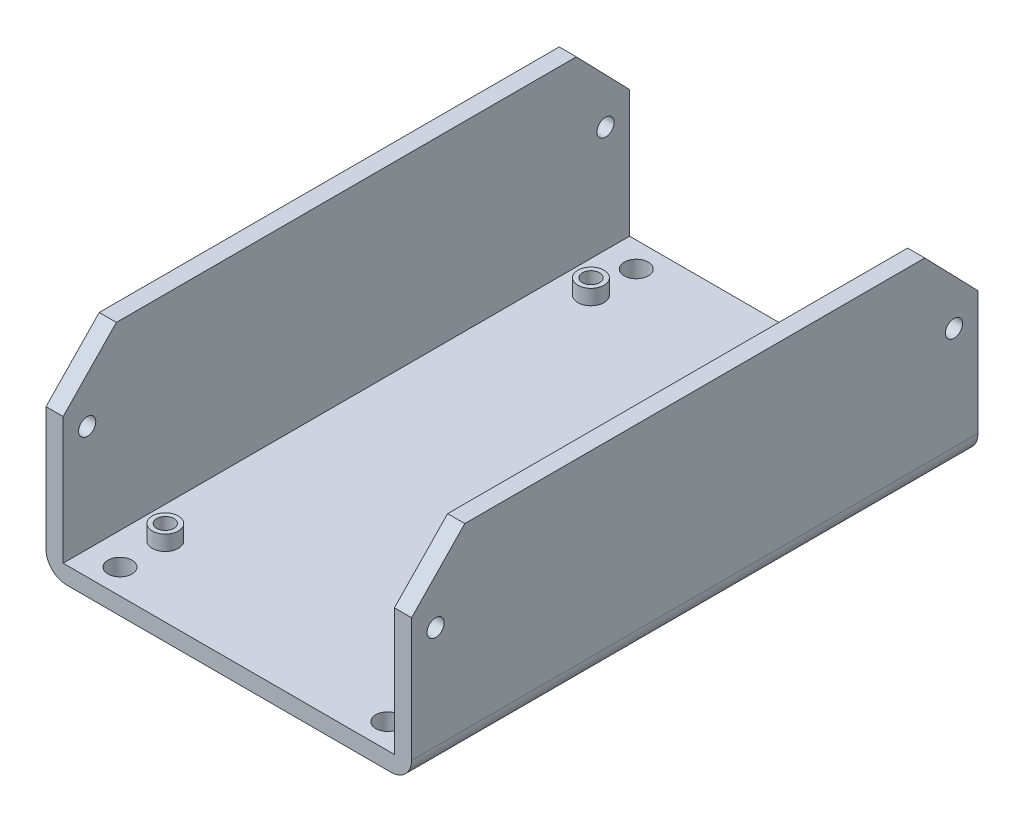
ISO-10303-21;
HEADER;
FILE_DESCRIPTION(('STEP AP214'),'2;1');
FILE_NAME('part.step','',(''),(''),'','','');
FILE_SCHEMA(('AUTOMOTIVE_DESIGN { 1 0 10303 214 1 1 1 1 }'));
ENDSEC;
DATA;
#1=APPLICATION_CONTEXT('core data for automotive mechanical design processes');
#2=APPLICATION_PROTOCOL_DEFINITION('international standard','automotive_design',2000,#1);
#3=PRODUCT_CONTEXT('',#1,'mechanical');
#4=PRODUCT('Part','Part','',(#3));
#5=PRODUCT_RELATED_PRODUCT_CATEGORY('part','',(#4));
#6=PRODUCT_DEFINITION_FORMATION('','',#4);
#7=PRODUCT_DEFINITION_CONTEXT('part definition',#1,'design');
#8=PRODUCT_DEFINITION('design','',#6,#7);
#9=PRODUCT_DEFINITION_SHAPE('','',#8);
#10=(LENGTH_UNIT() NAMED_UNIT(*) SI_UNIT(.MILLI.,.METRE.));
#11=(NAMED_UNIT(*) PLANE_ANGLE_UNIT() SI_UNIT($,.RADIAN.));
#12=(NAMED_UNIT(*) SI_UNIT($,.STERADIAN.) SOLID_ANGLE_UNIT());
#13=UNCERTAINTY_MEASURE_WITH_UNIT(LENGTH_MEASURE(1.E-05),#10,'distance_accuracy_value','');
#14=(GEOMETRIC_REPRESENTATION_CONTEXT(3) GLOBAL_UNCERTAINTY_ASSIGNED_CONTEXT((#13)) GLOBAL_UNIT_ASSIGNED_CONTEXT((#10,
#11,#12)) REPRESENTATION_CONTEXT('',''));
#15=CARTESIAN_POINT('',(0.,0.,0.));
#16=DIRECTION('',(0.,0.,1.));
#17=DIRECTION('',(1.,0.,0.));
#18=AXIS2_PLACEMENT_3D('',#15,#16,#17);
#19=CARTESIAN_POINT('',(-24.125,2.49999999999999,41.25));
#20=DIRECTION('',(-1.,0.,0.));
#21=DIRECTION('',(0.,0.,1.));
#22=AXIS2_PLACEMENT_3D('',#19,#20,#21);
#23=PLANE('',#22);
#24=CARTESIAN_POINT('',(-24.125,18.,-37.75));
#25=DIRECTION('',(-1.,0.,0.));
#26=DIRECTION('',(0.,0.,1.));
#27=AXIS2_PLACEMENT_3D('',#24,#25,#26);
#28=CIRCLE('',#27,1.24999999999999);
#29=CARTESIAN_POINT('',(-24.125,18.,-36.5));
#30=VERTEX_POINT('',#29);
#31=EDGE_CURVE('E360',#30,#30,#28,.F.);
#32=ORIENTED_EDGE('',*,*,#31,.F.);
#33=EDGE_LOOP('',(#32));
#34=FACE_BOUND('',#33,.T.);
#35=DIRECTION('',(0.,1.,0.));
#36=VECTOR('',#35,1.);
#37=CARTESIAN_POINT('',(-24.125,2.49999999999999,-41.25));
#38=LINE('',#37,#36);
#39=CARTESIAN_POINT('',(-24.125,2.49999999999999,-41.25));
#40=VERTEX_POINT('',#39);
#41=CARTESIAN_POINT('',(-24.125,21.,-41.25));
#42=VERTEX_POINT('',#41);
#43=EDGE_CURVE('E255',#40,#42,#38,.T.);
#44=ORIENTED_EDGE('',*,*,#43,.T.);
#45=DIRECTION('',(0.,0.718240222789173,0.695795215827013));
#46=VECTOR('',#45,1.);
#47=CARTESIAN_POINT('',(-24.125,52.6856423173804,-10.5545340050377));
#48=LINE('',#47,#46);
#49=CARTESIAN_POINT('',(-24.125,29.,-33.5));
#50=VERTEX_POINT('',#49);
#51=EDGE_CURVE('E323',#42,#50,#48,.T.);
#52=ORIENTED_EDGE('',*,*,#51,.T.);
#53=DIRECTION('',(0.,0.,-1.));
#54=VECTOR('',#53,1.);
#55=CARTESIAN_POINT('',(-24.125,29.,41.25));
#56=LINE('',#55,#54);
#57=CARTESIAN_POINT('',(-24.125,29.,33.5));
#58=VERTEX_POINT('',#57);
#59=EDGE_CURVE('E265',#58,#50,#56,.T.);
#60=ORIENTED_EDGE('',*,*,#59,.F.);
#61=DIRECTION('',(0.,-0.718240222789173,0.695795215827013));
#62=VECTOR('',#61,1.);
#63=CARTESIAN_POINT('',(-24.125,11.4564231738035,50.4953400503778));
#64=LINE('',#63,#62);
#65=CARTESIAN_POINT('',(-24.125,21.,41.25));
#66=VERTEX_POINT('',#65);
#67=EDGE_CURVE('E320',#58,#66,#64,.T.);
#68=ORIENTED_EDGE('',*,*,#67,.T.);
#69=DIRECTION('',(0.,1.,0.));
#70=VECTOR('',#69,1.);
#71=CARTESIAN_POINT('',(-24.125,2.49999999999999,41.25));
#72=LINE('',#71,#70);
#73=CARTESIAN_POINT('',(-24.125,2.49999999999999,41.25));
#74=VERTEX_POINT('',#73);
#75=EDGE_CURVE('E264',#74,#66,#72,.T.);
#76=ORIENTED_EDGE('',*,*,#75,.F.);
#77=DIRECTION('',(0.,0.,-1.));
#78=VECTOR('',#77,1.);
#79=CARTESIAN_POINT('',(-24.125,2.49999999999999,41.25));
#80=LINE('',#79,#78);
#81=EDGE_CURVE('E249',#74,#40,#80,.T.);
#82=ORIENTED_EDGE('',*,*,#81,.T.);
#83=EDGE_LOOP('',(#44,#52,#60,#68,#76,#82));
#84=FACE_BOUND('',#83,.T.);
#85=CARTESIAN_POINT('',(-24.125,18.,37.75));
#86=DIRECTION('',(-1.,0.,0.));
#87=DIRECTION('',(0.,0.,1.));
#88=AXIS2_PLACEMENT_3D('',#85,#86,#87);
#89=CIRCLE('',#88,1.24999999999999);
#90=CARTESIAN_POINT('',(-24.125,18.,39.));
#91=VERTEX_POINT('',#90);
#92=EDGE_CURVE('E354',#91,#91,#89,.F.);
#93=ORIENTED_EDGE('',*,*,#92,.F.);
#94=EDGE_LOOP('',(#93));
#95=FACE_BOUND('',#94,.T.);
#96=ADVANCED_FACE('F49',(#34,#84,#95),#23,.F.);
#97=CARTESIAN_POINT('',(24.125,29.,41.25));
#98=DIRECTION('',(1.,0.,0.));
#99=DIRECTION('',(0.,0.,-1.));
#100=AXIS2_PLACEMENT_3D('',#97,#98,#99);
#101=PLANE('',#100);
#102=DIRECTION('',(0.,0.,-1.));
#103=VECTOR('',#102,1.);
#104=CARTESIAN_POINT('',(24.125,29.,41.25));
#105=LINE('',#104,#103);
#106=CARTESIAN_POINT('',(24.125,29.,33.5));
#107=VERTEX_POINT('',#106);
#108=CARTESIAN_POINT('',(24.125,29.,-33.5));
#109=VERTEX_POINT('',#108);
#110=EDGE_CURVE('E178',#107,#109,#105,.T.);
#111=ORIENTED_EDGE('',*,*,#110,.T.);
#112=DIRECTION('',(0.,-0.718240222789173,-0.695795215827013));
#113=VECTOR('',#112,1.);
#114=CARTESIAN_POINT('',(24.125,66.3561712846348,2.68879093198998));
#115=LINE('',#114,#113);
#116=CARTESIAN_POINT('',(24.125,21.,-41.25));
#117=VERTEX_POINT('',#116);
#118=EDGE_CURVE('E155',#109,#117,#115,.T.);
#119=ORIENTED_EDGE('',*,*,#118,.T.);
#120=DIRECTION('',(0.,-1.,0.));
#121=VECTOR('',#120,1.);
#122=CARTESIAN_POINT('',(24.125,29.,-41.25));
#123=LINE('',#122,#121);
#124=CARTESIAN_POINT('',(24.125,2.49999999999999,-41.25));
#125=VERTEX_POINT('',#124);
#126=EDGE_CURVE('E256',#117,#125,#123,.T.);
#127=ORIENTED_EDGE('',*,*,#126,.T.);
#128=DIRECTION('',(0.,0.,-1.));
#129=VECTOR('',#128,1.);
#130=CARTESIAN_POINT('',(24.125,2.49999999999999,41.25));
#131=LINE('',#130,#129);
#132=CARTESIAN_POINT('',(24.125,2.49999999999999,41.25));
#133=VERTEX_POINT('',#132);
#134=EDGE_CURVE('E182',#133,#125,#131,.T.);
#135=ORIENTED_EDGE('',*,*,#134,.F.);
#136=DIRECTION('',(0.,-1.,0.));
#137=VECTOR('',#136,1.);
#138=CARTESIAN_POINT('',(24.125,29.,41.25));
#139=LINE('',#138,#137);
#140=CARTESIAN_POINT('',(24.125,21.,41.25));
#141=VERTEX_POINT('',#140);
#142=EDGE_CURVE('E285',#141,#133,#139,.T.);
#143=ORIENTED_EDGE('',*,*,#142,.F.);
#144=DIRECTION('',(0.,0.718240222789173,-0.695795215827013));
#145=VECTOR('',#144,1.);
#146=CARTESIAN_POINT('',(24.125,25.1269521410579,37.2520151133501));
#147=LINE('',#146,#145);
#148=EDGE_CURVE('E64',#141,#107,#147,.T.);
#149=ORIENTED_EDGE('',*,*,#148,.T.);
#150=EDGE_LOOP('',(#111,#119,#127,#135,#143,#149));
#151=FACE_BOUND('',#150,.T.);
#152=CARTESIAN_POINT('',(24.125,18.,37.75));
#153=DIRECTION('',(1.,0.,0.));
#154=DIRECTION('',(0.,0.,-1.));
#155=AXIS2_PLACEMENT_3D('',#152,#153,#154);
#156=CIRCLE('',#155,1.24999999999999);
#157=CARTESIAN_POINT('',(24.125,18.,36.5));
#158=VERTEX_POINT('',#157);
#159=EDGE_CURVE('E340',#158,#158,#156,.F.);
#160=ORIENTED_EDGE('',*,*,#159,.F.);
#161=EDGE_LOOP('',(#160));
#162=FACE_BOUND('',#161,.T.);
#163=CARTESIAN_POINT('',(24.125,18.,-37.75));
#164=DIRECTION('',(1.,0.,0.));
#165=DIRECTION('',(0.,0.,-1.));
#166=AXIS2_PLACEMENT_3D('',#163,#164,#165);
#167=CIRCLE('',#166,1.24999999999999);
#168=CARTESIAN_POINT('',(24.125,18.,-39.));
#169=VERTEX_POINT('',#168);
#170=EDGE_CURVE('E348',#169,#169,#167,.F.);
#171=ORIENTED_EDGE('',*,*,#170,.F.);
#172=EDGE_LOOP('',(#171));
#173=FACE_BOUND('',#172,.T.);
#174=ADVANCED_FACE('F298',(#151,#162,#173),#101,.F.);
#175=CARTESIAN_POINT('',(-24.125,29.,41.25));
#176=DIRECTION('',(0.,-1.,0.));
#177=DIRECTION('',(1.,0.,0.));
#178=AXIS2_PLACEMENT_3D('',#175,#176,#177);
#179=PLANE('',#178);
#180=ORIENTED_EDGE('',*,*,#59,.T.);
#181=DIRECTION('',(1.,0.,0.));
#182=VECTOR('',#181,1.);
#183=CARTESIAN_POINT('',(-26.625,29.,-33.5));
#184=LINE('',#183,#182);
#185=CARTESIAN_POINT('',(-26.625,29.,-33.5));
#186=VERTEX_POINT('',#185);
#187=EDGE_CURVE('E160',#186,#50,#184,.T.);
#188=ORIENTED_EDGE('',*,*,#187,.F.);
#189=DIRECTION('',(0.,0.,-1.));
#190=VECTOR('',#189,1.);
#191=CARTESIAN_POINT('',(-26.625,29.,41.25));
#192=LINE('',#191,#190);
#193=CARTESIAN_POINT('',(-26.625,29.,33.5));
#194=VERTEX_POINT('',#193);
#195=EDGE_CURVE('E194',#194,#186,#192,.T.);
#196=ORIENTED_EDGE('',*,*,#195,.F.);
#197=DIRECTION('',(1.,0.,0.));
#198=VECTOR('',#197,1.);
#199=CARTESIAN_POINT('',(-26.625,29.,33.5));
#200=LINE('',#199,#198);
#201=EDGE_CURVE('E172',#194,#58,#200,.T.);
#202=ORIENTED_EDGE('',*,*,#201,.T.);
#203=EDGE_LOOP('',(#180,#188,#196,#202));
#204=FACE_BOUND('',#203,.T.);
#205=ADVANCED_FACE('F51',(#204),#179,.F.);
#206=CARTESIAN_POINT('',(-26.625,29.,41.25));
#207=DIRECTION('',(1.,0.,0.));
#208=DIRECTION('',(0.,1.,0.));
#209=AXIS2_PLACEMENT_3D('',#206,#207,#208);
#210=PLANE('',#209);
#211=CARTESIAN_POINT('',(-26.625,18.,-37.75));
#212=DIRECTION('',(-1.,0.,0.));
#213=DIRECTION('',(0.,0.,1.));
#214=AXIS2_PLACEMENT_3D('',#211,#212,#213);
#215=CIRCLE('',#214,1.24999999999999);
#216=CARTESIAN_POINT('',(-26.625,18.,-36.5));
#217=VERTEX_POINT('',#216);
#218=EDGE_CURVE('E363',#217,#217,#215,.T.);
#219=ORIENTED_EDGE('',*,*,#218,.F.);
#220=EDGE_LOOP('',(#219));
#221=FACE_BOUND('',#220,.T.);
#222=CARTESIAN_POINT('',(-26.625,18.,37.75));
#223=DIRECTION('',(-1.,0.,0.));
#224=DIRECTION('',(0.,0.,1.));
#225=AXIS2_PLACEMENT_3D('',#222,#223,#224);
#226=CIRCLE('',#225,1.24999999999999);
#227=CARTESIAN_POINT('',(-26.625,18.,39.));
#228=VERTEX_POINT('',#227);
#229=EDGE_CURVE('E357',#228,#228,#226,.T.);
#230=ORIENTED_EDGE('',*,*,#229,.F.);
#231=EDGE_LOOP('',(#230));
#232=FACE_BOUND('',#231,.T.);
#233=ORIENTED_EDGE('',*,*,#195,.T.);
#234=DIRECTION('',(0.,-0.718240222789173,-0.695795215827013));
#235=VECTOR('',#234,1.);
#236=CARTESIAN_POINT('',(-26.625,29.,-33.5));
#237=LINE('',#236,#235);
#238=CARTESIAN_POINT('',(-26.625,21.,-41.25));
#239=VERTEX_POINT('',#238);
#240=EDGE_CURVE('E161',#186,#239,#237,.T.);
#241=ORIENTED_EDGE('',*,*,#240,.T.);
#242=DIRECTION('',(0.,-1.,0.));
#243=VECTOR('',#242,1.);
#244=CARTESIAN_POINT('',(-26.625,29.,-41.25));
#245=LINE('',#244,#243);
#246=CARTESIAN_POINT('',(-26.625,3.,-41.25));
#247=VERTEX_POINT('',#246);
#248=EDGE_CURVE('E289',#239,#247,#245,.T.);
#249=ORIENTED_EDGE('',*,*,#248,.T.);
#250=DIRECTION('',(0.,0.,-1.));
#251=VECTOR('',#250,1.);
#252=CARTESIAN_POINT('',(-26.625,3.,41.25));
#253=LINE('',#252,#251);
#254=CARTESIAN_POINT('',(-26.625,3.,41.25));
#255=VERTEX_POINT('',#254);
#256=EDGE_CURVE('E191',#255,#247,#253,.T.);
#257=ORIENTED_EDGE('',*,*,#256,.F.);
#258=DIRECTION('',(0.,-1.,0.));
#259=VECTOR('',#258,1.);
#260=CARTESIAN_POINT('',(-26.625,29.,41.25));
#261=LINE('',#260,#259);
#262=CARTESIAN_POINT('',(-26.625,21.,41.25));
#263=VERTEX_POINT('',#262);
#264=EDGE_CURVE('E271',#263,#255,#261,.T.);
#265=ORIENTED_EDGE('',*,*,#264,.F.);
#266=DIRECTION('',(0.,0.718240222789173,-0.695795215827013));
#267=VECTOR('',#266,1.);
#268=CARTESIAN_POINT('',(-26.625,21.,41.25));
#269=LINE('',#268,#267);
#270=EDGE_CURVE('E72',#263,#194,#269,.T.);
#271=ORIENTED_EDGE('',*,*,#270,.T.);
#272=EDGE_LOOP('',(#233,#241,#249,#257,#265,#271));
#273=FACE_BOUND('',#272,.T.);
#274=ADVANCED_FACE('F449',(#221,#232,#273),#210,.F.);
#275=CARTESIAN_POINT('',(-23.625,3.,41.25));
#276=DIRECTION('',(0.,0.,-1.));
#277=DIRECTION('',(-1.,0.,0.));
#278=AXIS2_PLACEMENT_3D('',#275,#276,#277);
#279=CYLINDRICAL_SURFACE('',#278,3.);
#280=CARTESIAN_POINT('',(-23.625,3.,-41.25));
#281=DIRECTION('',(0.,0.,1.));
#282=DIRECTION('',(1.,0.,0.));
#283=AXIS2_PLACEMENT_3D('',#280,#281,#282);
#284=CIRCLE('',#283,3.);
#285=CARTESIAN_POINT('',(-23.625,0.,-41.25));
#286=VERTEX_POINT('',#285);
#287=EDGE_CURVE('E291',#247,#286,#284,.T.);
#288=ORIENTED_EDGE('',*,*,#287,.T.);
#289=DIRECTION('',(0.,0.,-1.));
#290=VECTOR('',#289,1.);
#291=CARTESIAN_POINT('',(-23.625,0.,41.25));
#292=LINE('',#291,#290);
#293=CARTESIAN_POINT('',(-23.625,0.,41.25));
#294=VERTEX_POINT('',#293);
#295=EDGE_CURVE('E188',#294,#286,#292,.T.);
#296=ORIENTED_EDGE('',*,*,#295,.F.);
#297=CARTESIAN_POINT('',(-23.625,3.,41.25));
#298=DIRECTION('',(0.,0.,1.));
#299=DIRECTION('',(1.,0.,0.));
#300=AXIS2_PLACEMENT_3D('',#297,#298,#299);
#301=CIRCLE('',#300,3.);
#302=EDGE_CURVE('E273',#255,#294,#301,.T.);
#303=ORIENTED_EDGE('',*,*,#302,.F.);
#304=ORIENTED_EDGE('',*,*,#256,.T.);
#305=EDGE_LOOP('',(#288,#296,#303,#304));
#306=FACE_BOUND('',#305,.T.);
#307=ADVANCED_FACE('F446',(#306),#279,.T.);
#308=CARTESIAN_POINT('',(-23.625,0.,41.25));
#309=DIRECTION('',(0.,1.,0.));
#310=DIRECTION('',(-1.,0.,0.));
#311=AXIS2_PLACEMENT_3D('',#308,#309,#310);
#312=PLANE('',#311);
#313=CARTESIAN_POINT('',(19.5,0.,-31.));
#314=DIRECTION('',(0.,1.,0.));
#315=DIRECTION('',(0.,0.,1.));
#316=AXIS2_PLACEMENT_3D('',#313,#314,#315);
#317=CIRCLE('',#316,1.24999999999999);
#318=CARTESIAN_POINT('',(19.5,0.,-29.75));
#319=VERTEX_POINT('',#318);
#320=EDGE_CURVE('E398',#319,#319,#317,.T.);
#321=ORIENTED_EDGE('',*,*,#320,.T.);
#322=EDGE_LOOP('',(#321));
#323=FACE_BOUND('',#322,.T.);
#324=CARTESIAN_POINT('',(-19.5,0.,-31.));
#325=DIRECTION('',(0.,1.,0.));
#326=DIRECTION('',(0.,0.,1.));
#327=AXIS2_PLACEMENT_3D('',#324,#325,#326);
#328=CIRCLE('',#327,1.24999999999999);
#329=CARTESIAN_POINT('',(-19.5,0.,-29.75));
#330=VERTEX_POINT('',#329);
#331=EDGE_CURVE('E392',#330,#330,#328,.T.);
#332=ORIENTED_EDGE('',*,*,#331,.T.);
#333=EDGE_LOOP('',(#332));
#334=FACE_BOUND('',#333,.T.);
#335=CARTESIAN_POINT('',(19.5,0.,31.));
#336=DIRECTION('',(0.,1.,0.));
#337=DIRECTION('',(0.,0.,1.));
#338=AXIS2_PLACEMENT_3D('',#335,#336,#337);
#339=CIRCLE('',#338,1.24999999999999);
#340=CARTESIAN_POINT('',(19.5,0.,32.25));
#341=VERTEX_POINT('',#340);
#342=EDGE_CURVE('E386',#341,#341,#339,.T.);
#343=ORIENTED_EDGE('',*,*,#342,.T.);
#344=EDGE_LOOP('',(#343));
#345=FACE_BOUND('',#344,.T.);
#346=CARTESIAN_POINT('',(-19.5,0.,31.));
#347=DIRECTION('',(0.,1.,0.));
#348=DIRECTION('',(0.,0.,1.));
#349=AXIS2_PLACEMENT_3D('',#346,#347,#348);
#350=CIRCLE('',#349,1.24999999999999);
#351=CARTESIAN_POINT('',(-19.5,0.,32.25));
#352=VERTEX_POINT('',#351);
#353=EDGE_CURVE('E380',#352,#352,#350,.T.);
#354=ORIENTED_EDGE('',*,*,#353,.T.);
#355=EDGE_LOOP('',(#354));
#356=FACE_BOUND('',#355,.T.);
#357=CARTESIAN_POINT('',(19.5,0.,-37.6));
#358=DIRECTION('',(0.,-1.,0.));
#359=DIRECTION('',(1.,0.,0.));
#360=AXIS2_PLACEMENT_3D('',#357,#358,#359);
#361=CIRCLE('',#360,1.75);
#362=CARTESIAN_POINT('',(21.25,0.,-37.6));
#363=VERTEX_POINT('',#362);
#364=EDGE_CURVE('E336',#363,#363,#361,.T.);
#365=ORIENTED_EDGE('',*,*,#364,.F.);
#366=EDGE_LOOP('',(#365));
#367=FACE_BOUND('',#366,.T.);
#368=CARTESIAN_POINT('',(19.5,0.,37.6));
#369=DIRECTION('',(0.,-1.,0.));
#370=DIRECTION('',(1.,0.,0.));
#371=AXIS2_PLACEMENT_3D('',#368,#369,#370);
#372=CIRCLE('',#371,1.75);
#373=CARTESIAN_POINT('',(21.25,0.,37.6));
#374=VERTEX_POINT('',#373);
#375=EDGE_CURVE('E339',#374,#374,#372,.T.);
#376=ORIENTED_EDGE('',*,*,#375,.F.);
#377=EDGE_LOOP('',(#376));
#378=FACE_BOUND('',#377,.T.);
#379=CARTESIAN_POINT('',(-19.5,0.,37.6));
#380=DIRECTION('',(0.,-1.,0.));
#381=DIRECTION('',(1.,0.,0.));
#382=AXIS2_PLACEMENT_3D('',#379,#380,#381);
#383=CIRCLE('',#382,1.75);
#384=CARTESIAN_POINT('',(-17.75,0.,37.6));
#385=VERTEX_POINT('',#384);
#386=EDGE_CURVE('E335',#385,#385,#383,.T.);
#387=ORIENTED_EDGE('',*,*,#386,.F.);
#388=EDGE_LOOP('',(#387));
#389=FACE_BOUND('',#388,.T.);
#390=CARTESIAN_POINT('',(-19.5,0.,-37.6));
#391=DIRECTION('',(0.,-1.,0.));
#392=DIRECTION('',(1.,0.,0.));
#393=AXIS2_PLACEMENT_3D('',#390,#391,#392);
#394=CIRCLE('',#393,1.75);
#395=CARTESIAN_POINT('',(-17.75,0.,-37.6));
#396=VERTEX_POINT('',#395);
#397=EDGE_CURVE('E206',#396,#396,#394,.T.);
#398=ORIENTED_EDGE('',*,*,#397,.F.);
#399=EDGE_LOOP('',(#398));
#400=FACE_BOUND('',#399,.T.);
#401=DIRECTION('',(1.,0.,0.));
#402=VECTOR('',#401,1.);
#403=CARTESIAN_POINT('',(-23.625,0.,-41.25));
#404=LINE('',#403,#402);
#405=CARTESIAN_POINT('',(23.625,0.,-41.25));
#406=VERTEX_POINT('',#405);
#407=EDGE_CURVE('E293',#286,#406,#404,.T.);
#408=ORIENTED_EDGE('',*,*,#407,.T.);
#409=DIRECTION('',(0.,0.,-1.));
#410=VECTOR('',#409,1.);
#411=CARTESIAN_POINT('',(23.625,0.,41.25));
#412=LINE('',#411,#410);
#413=CARTESIAN_POINT('',(23.625,0.,41.25));
#414=VERTEX_POINT('',#413);
#415=EDGE_CURVE('E180',#414,#406,#412,.T.);
#416=ORIENTED_EDGE('',*,*,#415,.F.);
#417=DIRECTION('',(1.,0.,0.));
#418=VECTOR('',#417,1.);
#419=CARTESIAN_POINT('',(-23.625,0.,41.25));
#420=LINE('',#419,#418);
#421=EDGE_CURVE('E314',#294,#414,#420,.T.);
#422=ORIENTED_EDGE('',*,*,#421,.F.);
#423=ORIENTED_EDGE('',*,*,#295,.T.);
#424=EDGE_LOOP('',(#408,#416,#422,#423));
#425=FACE_BOUND('',#424,.T.);
#426=ADVANCED_FACE('F443',(#323,#334,#345,#356,#367,#378,#389,#400,#425),#312,.F.);
#427=CARTESIAN_POINT('',(23.625,3.,41.25));
#428=DIRECTION('',(0.,0.,-1.));
#429=DIRECTION('',(-1.,0.,0.));
#430=AXIS2_PLACEMENT_3D('',#427,#428,#429);
#431=CYLINDRICAL_SURFACE('',#430,3.);
#432=CARTESIAN_POINT('',(23.625,3.,-41.25));
#433=DIRECTION('',(0.,0.,1.));
#434=DIRECTION('',(1.,0.,0.));
#435=AXIS2_PLACEMENT_3D('',#432,#433,#434);
#436=CIRCLE('',#435,3.);
#437=CARTESIAN_POINT('',(26.625,3.,-41.25));
#438=VERTEX_POINT('',#437);
#439=EDGE_CURVE('E295',#406,#438,#436,.T.);
#440=ORIENTED_EDGE('',*,*,#439,.T.);
#441=DIRECTION('',(0.,0.,-1.));
#442=VECTOR('',#441,1.);
#443=CARTESIAN_POINT('',(26.625,3.,41.25));
#444=LINE('',#443,#442);
#445=CARTESIAN_POINT('',(26.625,3.,41.25));
#446=VERTEX_POINT('',#445);
#447=EDGE_CURVE('E177',#446,#438,#444,.T.);
#448=ORIENTED_EDGE('',*,*,#447,.F.);
#449=CARTESIAN_POINT('',(23.625,3.,41.25));
#450=DIRECTION('',(0.,0.,1.));
#451=DIRECTION('',(1.,0.,0.));
#452=AXIS2_PLACEMENT_3D('',#449,#450,#451);
#453=CIRCLE('',#452,3.);
#454=EDGE_CURVE('E312',#414,#446,#453,.T.);
#455=ORIENTED_EDGE('',*,*,#454,.F.);
#456=ORIENTED_EDGE('',*,*,#415,.T.);
#457=EDGE_LOOP('',(#440,#448,#455,#456));
#458=FACE_BOUND('',#457,.T.);
#459=ADVANCED_FACE('F306',(#458),#431,.T.);
#460=CARTESIAN_POINT('',(26.625,3.,41.25));
#461=DIRECTION('',(-1.,0.,0.));
#462=DIRECTION('',(0.,-1.,0.));
#463=AXIS2_PLACEMENT_3D('',#460,#461,#462);
#464=PLANE('',#463);
#465=CARTESIAN_POINT('',(26.625,18.,-37.75));
#466=DIRECTION('',(1.,0.,0.));
#467=DIRECTION('',(0.,0.,-1.));
#468=AXIS2_PLACEMENT_3D('',#465,#466,#467);
#469=CIRCLE('',#468,1.24999999999999);
#470=CARTESIAN_POINT('',(26.625,18.,-39.));
#471=VERTEX_POINT('',#470);
#472=EDGE_CURVE('E351',#471,#471,#469,.T.);
#473=ORIENTED_EDGE('',*,*,#472,.F.);
#474=EDGE_LOOP('',(#473));
#475=FACE_BOUND('',#474,.T.);
#476=CARTESIAN_POINT('',(26.625,18.,37.75));
#477=DIRECTION('',(1.,0.,0.));
#478=DIRECTION('',(0.,0.,-1.));
#479=AXIS2_PLACEMENT_3D('',#476,#477,#478);
#480=CIRCLE('',#479,1.24999999999999);
#481=CARTESIAN_POINT('',(26.625,18.,36.5));
#482=VERTEX_POINT('',#481);
#483=EDGE_CURVE('E345',#482,#482,#480,.T.);
#484=ORIENTED_EDGE('',*,*,#483,.F.);
#485=EDGE_LOOP('',(#484));
#486=FACE_BOUND('',#485,.T.);
#487=DIRECTION('',(0.,1.,0.));
#488=VECTOR('',#487,1.);
#489=CARTESIAN_POINT('',(26.625,3.,-41.25));
#490=LINE('',#489,#488);
#491=CARTESIAN_POINT('',(26.625,21.,-41.25));
#492=VERTEX_POINT('',#491);
#493=EDGE_CURVE('E171',#438,#492,#490,.T.);
#494=ORIENTED_EDGE('',*,*,#493,.T.);
#495=DIRECTION('',(0.,-0.718240222789173,-0.695795215827013));
#496=VECTOR('',#495,1.);
#497=CARTESIAN_POINT('',(26.625,29.,-33.5));
#498=LINE('',#497,#496);
#499=CARTESIAN_POINT('',(26.625,29.,-33.5));
#500=VERTEX_POINT('',#499);
#501=EDGE_CURVE('E152',#500,#492,#498,.T.);
#502=ORIENTED_EDGE('',*,*,#501,.F.);
#503=DIRECTION('',(0.,0.,-1.));
#504=VECTOR('',#503,1.);
#505=CARTESIAN_POINT('',(26.625,29.,41.25));
#506=LINE('',#505,#504);
#507=CARTESIAN_POINT('',(26.625,29.,33.5));
#508=VERTEX_POINT('',#507);
#509=EDGE_CURVE('E168',#508,#500,#506,.T.);
#510=ORIENTED_EDGE('',*,*,#509,.F.);
#511=DIRECTION('',(0.,0.718240222789173,-0.695795215827013));
#512=VECTOR('',#511,1.);
#513=CARTESIAN_POINT('',(26.625,21.,41.25));
#514=LINE('',#513,#512);
#515=CARTESIAN_POINT('',(26.625,21.,41.25));
#516=VERTEX_POINT('',#515);
#517=EDGE_CURVE('E215',#516,#508,#514,.T.);
#518=ORIENTED_EDGE('',*,*,#517,.F.);
#519=DIRECTION('',(0.,1.,0.));
#520=VECTOR('',#519,1.);
#521=CARTESIAN_POINT('',(26.625,3.,41.25));
#522=LINE('',#521,#520);
#523=EDGE_CURVE('E311',#446,#516,#522,.T.);
#524=ORIENTED_EDGE('',*,*,#523,.F.);
#525=ORIENTED_EDGE('',*,*,#447,.T.);
#526=EDGE_LOOP('',(#494,#502,#510,#518,#524,#525));
#527=FACE_BOUND('',#526,.T.);
#528=ADVANCED_FACE('F166',(#475,#486,#527),#464,.F.);
#529=CARTESIAN_POINT('',(26.625,29.,41.25));
#530=DIRECTION('',(0.,-1.,0.));
#531=DIRECTION('',(1.,0.,0.));
#532=AXIS2_PLACEMENT_3D('',#529,#530,#531);
#533=PLANE('',#532);
#534=ORIENTED_EDGE('',*,*,#509,.T.);
#535=EDGE_CURVE('E149',#109,#500,#184,.T.);
#536=ORIENTED_EDGE('',*,*,#535,.F.);
#537=ORIENTED_EDGE('',*,*,#110,.F.);
#538=EDGE_CURVE('E176',#107,#508,#200,.T.);
#539=ORIENTED_EDGE('',*,*,#538,.T.);
#540=EDGE_LOOP('',(#534,#536,#537,#539));
#541=FACE_BOUND('',#540,.T.);
#542=ADVANCED_FACE('F175',(#541),#533,.F.);
#543=CARTESIAN_POINT('',(24.125,2.49999999999999,41.25));
#544=DIRECTION('',(0.,-1.,0.));
#545=DIRECTION('',(0.,0.,-1.));
#546=AXIS2_PLACEMENT_3D('',#543,#544,#545);
#547=PLANE('',#546);
#548=CARTESIAN_POINT('',(-19.5,2.49999999999999,-31.));
#549=DIRECTION('',(0.,-1.,0.));
#550=DIRECTION('',(0.,0.,-1.));
#551=AXIS2_PLACEMENT_3D('',#548,#549,#550);
#552=CIRCLE('',#551,1.9);
#553=CARTESIAN_POINT('',(-19.5,2.49999999999999,-32.9));
#554=VERTEX_POINT('',#553);
#555=EDGE_CURVE('E13',#554,#554,#552,.F.);
#556=ORIENTED_EDGE('',*,*,#555,.F.);
#557=EDGE_LOOP('',(#556));
#558=FACE_BOUND('',#557,.T.);
#559=CARTESIAN_POINT('',(-19.5,2.49999999999999,31.));
#560=DIRECTION('',(0.,-1.,0.));
#561=DIRECTION('',(0.,0.,-1.));
#562=AXIS2_PLACEMENT_3D('',#559,#560,#561);
#563=CIRCLE('',#562,1.9);
#564=CARTESIAN_POINT('',(-19.5,2.49999999999999,29.1));
#565=VERTEX_POINT('',#564);
#566=EDGE_CURVE('E57',#565,#565,#563,.F.);
#567=ORIENTED_EDGE('',*,*,#566,.F.);
#568=EDGE_LOOP('',(#567));
#569=FACE_BOUND('',#568,.T.);
#570=CARTESIAN_POINT('',(19.5,2.49999999999999,31.));
#571=DIRECTION('',(0.,-1.,0.));
#572=DIRECTION('',(0.,0.,-1.));
#573=AXIS2_PLACEMENT_3D('',#570,#571,#572);
#574=CIRCLE('',#573,1.9);
#575=CARTESIAN_POINT('',(19.5,2.49999999999999,29.1));
#576=VERTEX_POINT('',#575);
#577=EDGE_CURVE('E218',#576,#576,#574,.F.);
#578=ORIENTED_EDGE('',*,*,#577,.F.);
#579=EDGE_LOOP('',(#578));
#580=FACE_BOUND('',#579,.T.);
#581=CARTESIAN_POINT('',(19.5,2.49999999999999,-31.));
#582=DIRECTION('',(0.,-1.,0.));
#583=DIRECTION('',(0.,0.,-1.));
#584=AXIS2_PLACEMENT_3D('',#581,#582,#583);
#585=CIRCLE('',#584,1.9);
#586=CARTESIAN_POINT('',(19.5,2.49999999999999,-32.9));
#587=VERTEX_POINT('',#586);
#588=EDGE_CURVE('E201',#587,#587,#585,.F.);
#589=ORIENTED_EDGE('',*,*,#588,.F.);
#590=EDGE_LOOP('',(#589));
#591=FACE_BOUND('',#590,.T.);
#592=CARTESIAN_POINT('',(19.5,2.49999999999999,-37.6));
#593=DIRECTION('',(0.,-1.,0.));
#594=DIRECTION('',(0.,0.,-1.));
#595=AXIS2_PLACEMENT_3D('',#592,#593,#594);
#596=CIRCLE('',#595,1.75);
#597=CARTESIAN_POINT('',(19.5,2.49999999999999,-39.35));
#598=VERTEX_POINT('',#597);
#599=EDGE_CURVE('E212',#598,#598,#596,.T.);
#600=ORIENTED_EDGE('',*,*,#599,.T.);
#601=EDGE_LOOP('',(#600));
#602=FACE_BOUND('',#601,.T.);
#603=CARTESIAN_POINT('',(19.5,2.49999999999999,37.6));
#604=DIRECTION('',(0.,-1.,0.));
#605=DIRECTION('',(0.,0.,-1.));
#606=AXIS2_PLACEMENT_3D('',#603,#604,#605);
#607=CIRCLE('',#606,1.75);
#608=CARTESIAN_POINT('',(19.5,2.49999999999999,35.85));
#609=VERTEX_POINT('',#608);
#610=EDGE_CURVE('E209',#609,#609,#607,.T.);
#611=ORIENTED_EDGE('',*,*,#610,.T.);
#612=EDGE_LOOP('',(#611));
#613=FACE_BOUND('',#612,.T.);
#614=CARTESIAN_POINT('',(-19.5,2.49999999999999,37.6));
#615=DIRECTION('',(0.,-1.,0.));
#616=DIRECTION('',(0.,0.,-1.));
#617=AXIS2_PLACEMENT_3D('',#614,#615,#616);
#618=CIRCLE('',#617,1.75);
#619=CARTESIAN_POINT('',(-19.5,2.49999999999999,35.85));
#620=VERTEX_POINT('',#619);
#621=EDGE_CURVE('E205',#620,#620,#618,.T.);
#622=ORIENTED_EDGE('',*,*,#621,.T.);
#623=EDGE_LOOP('',(#622));
#624=FACE_BOUND('',#623,.T.);
#625=CARTESIAN_POINT('',(-19.5,2.49999999999999,-37.6));
#626=DIRECTION('',(0.,-1.,0.));
#627=DIRECTION('',(0.,0.,-1.));
#628=AXIS2_PLACEMENT_3D('',#625,#626,#627);
#629=CIRCLE('',#628,1.75);
#630=CARTESIAN_POINT('',(-19.5,2.49999999999999,-39.35));
#631=VERTEX_POINT('',#630);
#632=EDGE_CURVE('E202',#631,#631,#629,.T.);
#633=ORIENTED_EDGE('',*,*,#632,.T.);
#634=EDGE_LOOP('',(#633));
#635=FACE_BOUND('',#634,.T.);
#636=DIRECTION('',(-1.,0.,0.));
#637=VECTOR('',#636,1.);
#638=CARTESIAN_POINT('',(24.125,2.49999999999999,-41.25));
#639=LINE('',#638,#637);
#640=EDGE_CURVE('E246',#125,#40,#639,.T.);
#641=ORIENTED_EDGE('',*,*,#640,.T.);
#642=ORIENTED_EDGE('',*,*,#81,.F.);
#643=DIRECTION('',(-1.,0.,0.));
#644=VECTOR('',#643,1.);
#645=CARTESIAN_POINT('',(24.125,2.49999999999999,41.25));
#646=LINE('',#645,#644);
#647=EDGE_CURVE('E282',#133,#74,#646,.T.);
#648=ORIENTED_EDGE('',*,*,#647,.F.);
#649=ORIENTED_EDGE('',*,*,#134,.T.);
#650=EDGE_LOOP('',(#641,#642,#648,#649));
#651=FACE_BOUND('',#650,.T.);
#652=ADVANCED_FACE('F225',(#558,#569,#580,#591,#602,#613,#624,#635,#651),#547,.F.);
#653=CARTESIAN_POINT('',(-23.625,3.,41.25));
#654=DIRECTION('',(0.,0.,1.));
#655=DIRECTION('',(1.,0.,0.));
#656=AXIS2_PLACEMENT_3D('',#653,#654,#655);
#657=PLANE('',#656);
#658=DIRECTION('',(1.,0.,0.));
#659=VECTOR('',#658,1.);
#660=CARTESIAN_POINT('',(-26.625,21.,41.25));
#661=LINE('',#660,#659);
#662=EDGE_CURVE('E325',#263,#66,#661,.T.);
#663=ORIENTED_EDGE('',*,*,#662,.F.);
#664=ORIENTED_EDGE('',*,*,#264,.T.);
#665=ORIENTED_EDGE('',*,*,#302,.T.);
#666=ORIENTED_EDGE('',*,*,#421,.T.);
#667=ORIENTED_EDGE('',*,*,#454,.T.);
#668=ORIENTED_EDGE('',*,*,#523,.T.);
#669=DIRECTION('',(1.,0.,0.));
#670=VECTOR('',#669,1.);
#671=CARTESIAN_POINT('',(-23.625,21.,41.25));
#672=LINE('',#671,#670);
#673=EDGE_CURVE('E199',#141,#516,#672,.T.);
#674=ORIENTED_EDGE('',*,*,#673,.F.);
#675=ORIENTED_EDGE('',*,*,#142,.T.);
#676=ORIENTED_EDGE('',*,*,#647,.T.);
#677=ORIENTED_EDGE('',*,*,#75,.T.);
#678=EDGE_LOOP('',(#663,#664,#665,#666,#667,#668,#674,#675,#676,#677));
#679=FACE_BOUND('',#678,.T.);
#680=ADVANCED_FACE('F228',(#679),#657,.T.);
#681=CARTESIAN_POINT('',(-23.625,3.,-41.25));
#682=DIRECTION('',(0.,0.,1.));
#683=DIRECTION('',(1.,0.,0.));
#684=AXIS2_PLACEMENT_3D('',#681,#682,#683);
#685=PLANE('',#684);
#686=ORIENTED_EDGE('',*,*,#248,.F.);
#687=DIRECTION('',(1.,0.,0.));
#688=VECTOR('',#687,1.);
#689=CARTESIAN_POINT('',(-26.625,21.,-41.25));
#690=LINE('',#689,#688);
#691=EDGE_CURVE('E270',#239,#42,#690,.T.);
#692=ORIENTED_EDGE('',*,*,#691,.T.);
#693=ORIENTED_EDGE('',*,*,#43,.F.);
#694=ORIENTED_EDGE('',*,*,#640,.F.);
#695=ORIENTED_EDGE('',*,*,#126,.F.);
#696=DIRECTION('',(1.,0.,0.));
#697=VECTOR('',#696,1.);
#698=CARTESIAN_POINT('',(-23.625,21.,-41.25));
#699=LINE('',#698,#697);
#700=EDGE_CURVE('E197',#117,#492,#699,.T.);
#701=ORIENTED_EDGE('',*,*,#700,.T.);
#702=ORIENTED_EDGE('',*,*,#493,.F.);
#703=ORIENTED_EDGE('',*,*,#439,.F.);
#704=ORIENTED_EDGE('',*,*,#407,.F.);
#705=ORIENTED_EDGE('',*,*,#287,.F.);
#706=EDGE_LOOP('',(#686,#692,#693,#694,#695,#701,#702,#703,#704,#705));
#707=FACE_BOUND('',#706,.T.);
#708=ADVANCED_FACE('F269',(#707),#685,.F.);
#709=CARTESIAN_POINT('',(-26.625,29.,-33.5));
#710=DIRECTION('',(0.,-0.695795215827013,0.718240222789173));
#711=DIRECTION('',(0.,-0.718240222789173,-0.695795215827013));
#712=AXIS2_PLACEMENT_3D('',#709,#710,#711);
#713=PLANE('',#712);
#714=ORIENTED_EDGE('',*,*,#535,.T.);
#715=ORIENTED_EDGE('',*,*,#501,.T.);
#716=ORIENTED_EDGE('',*,*,#700,.F.);
#717=ORIENTED_EDGE('',*,*,#118,.F.);
#718=EDGE_LOOP('',(#714,#715,#716,#717));
#719=FACE_BOUND('',#718,.T.);
#720=ADVANCED_FACE('F151',(#719),#713,.F.);
#721=ORIENTED_EDGE('',*,*,#691,.F.);
#722=ORIENTED_EDGE('',*,*,#240,.F.);
#723=ORIENTED_EDGE('',*,*,#187,.T.);
#724=ORIENTED_EDGE('',*,*,#51,.F.);
#725=EDGE_LOOP('',(#721,#722,#723,#724));
#726=FACE_BOUND('',#725,.T.);
#727=ADVANCED_FACE('F463',(#726),#713,.F.);
#728=CARTESIAN_POINT('',(-26.625,21.,41.25));
#729=DIRECTION('',(0.,-0.695795215827013,-0.718240222789173));
#730=DIRECTION('',(0.,0.718240222789173,-0.695795215827013));
#731=AXIS2_PLACEMENT_3D('',#728,#729,#730);
#732=PLANE('',#731);
#733=ORIENTED_EDGE('',*,*,#673,.T.);
#734=ORIENTED_EDGE('',*,*,#517,.T.);
#735=ORIENTED_EDGE('',*,*,#538,.F.);
#736=ORIENTED_EDGE('',*,*,#148,.F.);
#737=EDGE_LOOP('',(#733,#734,#735,#736));
#738=FACE_BOUND('',#737,.T.);
#739=ADVANCED_FACE('F475',(#738),#732,.F.);
#740=ORIENTED_EDGE('',*,*,#201,.F.);
#741=ORIENTED_EDGE('',*,*,#270,.F.);
#742=ORIENTED_EDGE('',*,*,#662,.T.);
#743=ORIENTED_EDGE('',*,*,#67,.F.);
#744=EDGE_LOOP('',(#740,#741,#742,#743));
#745=FACE_BOUND('',#744,.T.);
#746=ADVANCED_FACE('F464',(#745),#732,.F.);
#747=CARTESIAN_POINT('',(-19.5,10.,-37.6));
#748=DIRECTION('',(0.,-1.,0.));
#749=DIRECTION('',(1.,0.,0.));
#750=AXIS2_PLACEMENT_3D('',#747,#748,#749);
#751=CYLINDRICAL_SURFACE('',#750,1.75);
#752=ORIENTED_EDGE('',*,*,#397,.T.);
#753=EDGE_LOOP('',(#752));
#754=FACE_BOUND('',#753,.T.);
#755=ORIENTED_EDGE('',*,*,#632,.F.);
#756=EDGE_LOOP('',(#755));
#757=FACE_BOUND('',#756,.T.);
#758=ADVANCED_FACE('F480',(#754,#757),#751,.F.);
#759=CARTESIAN_POINT('',(-19.5,10.,37.6));
#760=DIRECTION('',(0.,-1.,0.));
#761=DIRECTION('',(1.,0.,0.));
#762=AXIS2_PLACEMENT_3D('',#759,#760,#761);
#763=CYLINDRICAL_SURFACE('',#762,1.75);
#764=ORIENTED_EDGE('',*,*,#386,.T.);
#765=EDGE_LOOP('',(#764));
#766=FACE_BOUND('',#765,.T.);
#767=ORIENTED_EDGE('',*,*,#621,.F.);
#768=EDGE_LOOP('',(#767));
#769=FACE_BOUND('',#768,.T.);
#770=ADVANCED_FACE('F483',(#766,#769),#763,.F.);
#771=CARTESIAN_POINT('',(19.5,10.,37.6));
#772=DIRECTION('',(0.,-1.,0.));
#773=DIRECTION('',(1.,0.,0.));
#774=AXIS2_PLACEMENT_3D('',#771,#772,#773);
#775=CYLINDRICAL_SURFACE('',#774,1.75);
#776=ORIENTED_EDGE('',*,*,#375,.T.);
#777=EDGE_LOOP('',(#776));
#778=FACE_BOUND('',#777,.T.);
#779=ORIENTED_EDGE('',*,*,#610,.F.);
#780=EDGE_LOOP('',(#779));
#781=FACE_BOUND('',#780,.T.);
#782=ADVANCED_FACE('F489',(#778,#781),#775,.F.);
#783=CARTESIAN_POINT('',(19.5,10.,-37.6));
#784=DIRECTION('',(0.,-1.,0.));
#785=DIRECTION('',(1.,0.,0.));
#786=AXIS2_PLACEMENT_3D('',#783,#784,#785);
#787=CYLINDRICAL_SURFACE('',#786,1.75);
#788=ORIENTED_EDGE('',*,*,#364,.T.);
#789=EDGE_LOOP('',(#788));
#790=FACE_BOUND('',#789,.T.);
#791=ORIENTED_EDGE('',*,*,#599,.F.);
#792=EDGE_LOOP('',(#791));
#793=FACE_BOUND('',#792,.T.);
#794=ADVANCED_FACE('F485',(#790,#793),#787,.F.);
#795=CARTESIAN_POINT('',(26.625,18.,37.75));
#796=DIRECTION('',(1.,0.,0.));
#797=DIRECTION('',(0.,0.,-1.));
#798=AXIS2_PLACEMENT_3D('',#795,#796,#797);
#799=CYLINDRICAL_SURFACE('',#798,1.24999999999999);
#800=ORIENTED_EDGE('',*,*,#159,.T.);
#801=EDGE_LOOP('',(#800));
#802=FACE_BOUND('',#801,.T.);
#803=ORIENTED_EDGE('',*,*,#483,.T.);
#804=EDGE_LOOP('',(#803));
#805=FACE_BOUND('',#804,.T.);
#806=ADVANCED_FACE('F488',(#802,#805),#799,.F.);
#807=CARTESIAN_POINT('',(26.625,18.,-37.75));
#808=DIRECTION('',(1.,0.,0.));
#809=DIRECTION('',(0.,0.,-1.));
#810=AXIS2_PLACEMENT_3D('',#807,#808,#809);
#811=CYLINDRICAL_SURFACE('',#810,1.24999999999999);
#812=ORIENTED_EDGE('',*,*,#170,.T.);
#813=EDGE_LOOP('',(#812));
#814=FACE_BOUND('',#813,.T.);
#815=ORIENTED_EDGE('',*,*,#472,.T.);
#816=EDGE_LOOP('',(#815));
#817=FACE_BOUND('',#816,.T.);
#818=ADVANCED_FACE('F499',(#814,#817),#811,.F.);
#819=CARTESIAN_POINT('',(-26.625,18.,37.75));
#820=DIRECTION('',(-1.,0.,0.));
#821=DIRECTION('',(0.,0.,1.));
#822=AXIS2_PLACEMENT_3D('',#819,#820,#821);
#823=CYLINDRICAL_SURFACE('',#822,1.24999999999999);
#824=ORIENTED_EDGE('',*,*,#92,.T.);
#825=EDGE_LOOP('',(#824));
#826=FACE_BOUND('',#825,.T.);
#827=ORIENTED_EDGE('',*,*,#229,.T.);
#828=EDGE_LOOP('',(#827));
#829=FACE_BOUND('',#828,.T.);
#830=ADVANCED_FACE('F422',(#826,#829),#823,.F.);
#831=CARTESIAN_POINT('',(-26.625,18.,-37.75));
#832=DIRECTION('',(-1.,0.,0.));
#833=DIRECTION('',(0.,0.,1.));
#834=AXIS2_PLACEMENT_3D('',#831,#832,#833);
#835=CYLINDRICAL_SURFACE('',#834,1.24999999999999);
#836=ORIENTED_EDGE('',*,*,#31,.T.);
#837=EDGE_LOOP('',(#836));
#838=FACE_BOUND('',#837,.T.);
#839=ORIENTED_EDGE('',*,*,#218,.T.);
#840=EDGE_LOOP('',(#839));
#841=FACE_BOUND('',#840,.T.);
#842=ADVANCED_FACE('F417',(#838,#841),#835,.F.);
#843=CARTESIAN_POINT('',(19.5,4.69999999999999,-31.));
#844=DIRECTION('',(0.,-1.,0.));
#845=DIRECTION('',(0.,0.,-1.));
#846=AXIS2_PLACEMENT_3D('',#843,#844,#845);
#847=CYLINDRICAL_SURFACE('',#846,1.9);
#848=CARTESIAN_POINT('',(19.5,4.69999999999999,-31.));
#849=DIRECTION('',(0.,1.,0.));
#850=DIRECTION('',(0.,0.,1.));
#851=AXIS2_PLACEMENT_3D('',#848,#849,#850);
#852=CIRCLE('',#851,1.9);
#853=CARTESIAN_POINT('',(19.5,4.69999999999999,-29.1));
#854=VERTEX_POINT('',#853);
#855=EDGE_CURVE('E366',#854,#854,#852,.T.);
#856=ORIENTED_EDGE('',*,*,#855,.F.);
#857=EDGE_LOOP('',(#856));
#858=FACE_BOUND('',#857,.T.);
#859=ORIENTED_EDGE('',*,*,#588,.T.);
#860=EDGE_LOOP('',(#859));
#861=FACE_BOUND('',#860,.T.);
#862=ADVANCED_FACE('F411',(#858,#861),#847,.T.);
#863=CARTESIAN_POINT('',(19.5,4.69999999999999,-31.));
#864=DIRECTION('',(0.,1.,0.));
#865=DIRECTION('',(0.,0.,1.));
#866=AXIS2_PLACEMENT_3D('',#863,#864,#865);
#867=PLANE('',#866);
#868=CARTESIAN_POINT('',(19.5,4.7,-31.));
#869=DIRECTION('',(0.,1.,0.));
#870=DIRECTION('',(0.,0.,1.));
#871=AXIS2_PLACEMENT_3D('',#868,#869,#870);
#872=CIRCLE('',#871,1.24999999999999);
#873=CARTESIAN_POINT('',(19.5,4.7,-29.75));
#874=VERTEX_POINT('',#873);
#875=EDGE_CURVE('E401',#874,#874,#872,.T.);
#876=ORIENTED_EDGE('',*,*,#875,.F.);
#877=EDGE_LOOP('',(#876));
#878=FACE_BOUND('',#877,.T.);
#879=ORIENTED_EDGE('',*,*,#855,.T.);
#880=EDGE_LOOP('',(#879));
#881=FACE_BOUND('',#880,.T.);
#882=ADVANCED_FACE('F407',(#878,#881),#867,.T.);
#883=CARTESIAN_POINT('',(19.5,4.69999999999999,31.));
#884=DIRECTION('',(0.,-1.,0.));
#885=DIRECTION('',(0.,0.,-1.));
#886=AXIS2_PLACEMENT_3D('',#883,#884,#885);
#887=CYLINDRICAL_SURFACE('',#886,1.9);
#888=CARTESIAN_POINT('',(19.5,4.69999999999999,31.));
#889=DIRECTION('',(0.,1.,0.));
#890=DIRECTION('',(0.,0.,1.));
#891=AXIS2_PLACEMENT_3D('',#888,#889,#890);
#892=CIRCLE('',#891,1.9);
#893=CARTESIAN_POINT('',(19.5,4.69999999999999,32.9));
#894=VERTEX_POINT('',#893);
#895=EDGE_CURVE('E371',#894,#894,#892,.T.);
#896=ORIENTED_EDGE('',*,*,#895,.F.);
#897=EDGE_LOOP('',(#896));
#898=FACE_BOUND('',#897,.T.);
#899=ORIENTED_EDGE('',*,*,#577,.T.);
#900=EDGE_LOOP('',(#899));
#901=FACE_BOUND('',#900,.T.);
#902=ADVANCED_FACE('F410',(#898,#901),#887,.T.);
#903=CARTESIAN_POINT('',(19.5,4.69999999999999,31.));
#904=DIRECTION('',(0.,1.,0.));
#905=DIRECTION('',(0.,0.,1.));
#906=AXIS2_PLACEMENT_3D('',#903,#904,#905);
#907=PLANE('',#906);
#908=CARTESIAN_POINT('',(19.5,4.7,31.));
#909=DIRECTION('',(0.,1.,0.));
#910=DIRECTION('',(0.,0.,1.));
#911=AXIS2_PLACEMENT_3D('',#908,#909,#910);
#912=CIRCLE('',#911,1.24999999999999);
#913=CARTESIAN_POINT('',(19.5,4.7,32.25));
#914=VERTEX_POINT('',#913);
#915=EDGE_CURVE('E389',#914,#914,#912,.T.);
#916=ORIENTED_EDGE('',*,*,#915,.F.);
#917=EDGE_LOOP('',(#916));
#918=FACE_BOUND('',#917,.T.);
#919=ORIENTED_EDGE('',*,*,#895,.T.);
#920=EDGE_LOOP('',(#919));
#921=FACE_BOUND('',#920,.T.);
#922=ADVANCED_FACE('F563',(#918,#921),#907,.T.);
#923=CARTESIAN_POINT('',(-19.5,4.69999999999999,31.));
#924=DIRECTION('',(0.,-1.,0.));
#925=DIRECTION('',(0.,0.,-1.));
#926=AXIS2_PLACEMENT_3D('',#923,#924,#925);
#927=CYLINDRICAL_SURFACE('',#926,1.9);
#928=CARTESIAN_POINT('',(-19.5,4.69999999999999,31.));
#929=DIRECTION('',(0.,1.,0.));
#930=DIRECTION('',(0.,0.,1.));
#931=AXIS2_PLACEMENT_3D('',#928,#929,#930);
#932=CIRCLE('',#931,1.9);
#933=CARTESIAN_POINT('',(-19.5,4.69999999999999,32.9));
#934=VERTEX_POINT('',#933);
#935=EDGE_CURVE('E374',#934,#934,#932,.T.);
#936=ORIENTED_EDGE('',*,*,#935,.F.);
#937=EDGE_LOOP('',(#936));
#938=FACE_BOUND('',#937,.T.);
#939=ORIENTED_EDGE('',*,*,#566,.T.);
#940=EDGE_LOOP('',(#939));
#941=FACE_BOUND('',#940,.T.);
#942=ADVANCED_FACE('F223',(#938,#941),#927,.T.);
#943=CARTESIAN_POINT('',(-19.5,4.69999999999999,31.));
#944=DIRECTION('',(0.,1.,0.));
#945=DIRECTION('',(0.,0.,1.));
#946=AXIS2_PLACEMENT_3D('',#943,#944,#945);
#947=PLANE('',#946);
#948=CARTESIAN_POINT('',(-19.5,4.7,31.));
#949=DIRECTION('',(0.,1.,0.));
#950=DIRECTION('',(0.,0.,1.));
#951=AXIS2_PLACEMENT_3D('',#948,#949,#950);
#952=CIRCLE('',#951,1.24999999999999);
#953=CARTESIAN_POINT('',(-19.5,4.7,32.25));
#954=VERTEX_POINT('',#953);
#955=EDGE_CURVE('E383',#954,#954,#952,.T.);
#956=ORIENTED_EDGE('',*,*,#955,.F.);
#957=EDGE_LOOP('',(#956));
#958=FACE_BOUND('',#957,.T.);
#959=ORIENTED_EDGE('',*,*,#935,.T.);
#960=EDGE_LOOP('',(#959));
#961=FACE_BOUND('',#960,.T.);
#962=ADVANCED_FACE('F538',(#958,#961),#947,.T.);
#963=CARTESIAN_POINT('',(-19.5,4.69999999999999,-31.));
#964=DIRECTION('',(0.,-1.,0.));
#965=DIRECTION('',(0.,0.,-1.));
#966=AXIS2_PLACEMENT_3D('',#963,#964,#965);
#967=CYLINDRICAL_SURFACE('',#966,1.9);
#968=CARTESIAN_POINT('',(-19.5,4.69999999999999,-31.));
#969=DIRECTION('',(0.,1.,0.));
#970=DIRECTION('',(0.,0.,1.));
#971=AXIS2_PLACEMENT_3D('',#968,#969,#970);
#972=CIRCLE('',#971,1.9);
#973=CARTESIAN_POINT('',(-19.5,4.69999999999999,-29.1));
#974=VERTEX_POINT('',#973);
#975=EDGE_CURVE('E377',#974,#974,#972,.T.);
#976=ORIENTED_EDGE('',*,*,#975,.F.);
#977=EDGE_LOOP('',(#976));
#978=FACE_BOUND('',#977,.T.);
#979=ORIENTED_EDGE('',*,*,#555,.T.);
#980=EDGE_LOOP('',(#979));
#981=FACE_BOUND('',#980,.T.);
#982=ADVANCED_FACE('F543',(#978,#981),#967,.T.);
#983=CARTESIAN_POINT('',(-19.5,4.69999999999999,-31.));
#984=DIRECTION('',(0.,1.,0.));
#985=DIRECTION('',(0.,0.,1.));
#986=AXIS2_PLACEMENT_3D('',#983,#984,#985);
#987=PLANE('',#986);
#988=CARTESIAN_POINT('',(-19.5,4.7,-31.));
#989=DIRECTION('',(0.,1.,0.));
#990=DIRECTION('',(0.,0.,1.));
#991=AXIS2_PLACEMENT_3D('',#988,#989,#990);
#992=CIRCLE('',#991,1.24999999999999);
#993=CARTESIAN_POINT('',(-19.5,4.7,-29.75));
#994=VERTEX_POINT('',#993);
#995=EDGE_CURVE('E395',#994,#994,#992,.T.);
#996=ORIENTED_EDGE('',*,*,#995,.F.);
#997=EDGE_LOOP('',(#996));
#998=FACE_BOUND('',#997,.T.);
#999=ORIENTED_EDGE('',*,*,#975,.T.);
#1000=EDGE_LOOP('',(#999));
#1001=FACE_BOUND('',#1000,.T.);
#1002=ADVANCED_FACE('F529',(#998,#1001),#987,.T.);
#1003=CARTESIAN_POINT('',(-19.5,4.69999999999999,31.));
#1004=DIRECTION('',(0.,1.,0.));
#1005=DIRECTION('',(0.,0.,1.));
#1006=AXIS2_PLACEMENT_3D('',#1003,#1004,#1005);
#1007=CYLINDRICAL_SURFACE('',#1006,1.24999999999999);
#1008=ORIENTED_EDGE('',*,*,#353,.F.);
#1009=EDGE_LOOP('',(#1008));
#1010=FACE_BOUND('',#1009,.T.);
#1011=ORIENTED_EDGE('',*,*,#955,.T.);
#1012=EDGE_LOOP('',(#1011));
#1013=FACE_BOUND('',#1012,.T.);
#1014=ADVANCED_FACE('F523',(#1010,#1013),#1007,.F.);
#1015=CARTESIAN_POINT('',(19.5,4.69999999999999,31.));
#1016=DIRECTION('',(0.,1.,0.));
#1017=DIRECTION('',(0.,0.,1.));
#1018=AXIS2_PLACEMENT_3D('',#1015,#1016,#1017);
#1019=CYLINDRICAL_SURFACE('',#1018,1.24999999999999);
#1020=ORIENTED_EDGE('',*,*,#342,.F.);
#1021=EDGE_LOOP('',(#1020));
#1022=FACE_BOUND('',#1021,.T.);
#1023=ORIENTED_EDGE('',*,*,#915,.T.);
#1024=EDGE_LOOP('',(#1023));
#1025=FACE_BOUND('',#1024,.T.);
#1026=ADVANCED_FACE('F528',(#1022,#1025),#1019,.F.);
#1027=CARTESIAN_POINT('',(-19.5,4.69999999999999,-31.));
#1028=DIRECTION('',(0.,1.,0.));
#1029=DIRECTION('',(0.,0.,1.));
#1030=AXIS2_PLACEMENT_3D('',#1027,#1028,#1029);
#1031=CYLINDRICAL_SURFACE('',#1030,1.24999999999999);
#1032=ORIENTED_EDGE('',*,*,#331,.F.);
#1033=EDGE_LOOP('',(#1032));
#1034=FACE_BOUND('',#1033,.T.);
#1035=ORIENTED_EDGE('',*,*,#995,.T.);
#1036=EDGE_LOOP('',(#1035));
#1037=FACE_BOUND('',#1036,.T.);
#1038=ADVANCED_FACE('F555',(#1034,#1037),#1031,.F.);
#1039=CARTESIAN_POINT('',(19.5,4.69999999999999,-31.));
#1040=DIRECTION('',(0.,1.,0.));
#1041=DIRECTION('',(0.,0.,1.));
#1042=AXIS2_PLACEMENT_3D('',#1039,#1040,#1041);
#1043=CYLINDRICAL_SURFACE('',#1042,1.24999999999999);
#1044=ORIENTED_EDGE('',*,*,#320,.F.);
#1045=EDGE_LOOP('',(#1044));
#1046=FACE_BOUND('',#1045,.T.);
#1047=ORIENTED_EDGE('',*,*,#875,.T.);
#1048=EDGE_LOOP('',(#1047));
#1049=FACE_BOUND('',#1048,.T.);
#1050=ADVANCED_FACE('F405',(#1046,#1049),#1043,.F.);
#1051=CLOSED_SHELL('',(#96,#174,#205,#274,#307,#426,#459,#528,#542,#652,#680,#708,#720,#727,
#739,#746,#758,#770,#782,#794,#806,#818,#830,#842,#862,#882,#902,#922,#942,#962,#982,#1002,
#1014,#1026,#1038,#1050));
#1052=MANIFOLD_SOLID_BREP('B2',#1051);
#1053=ADVANCED_BREP_SHAPE_REPRESENTATION('',(#18,#1052),#14);
#1054=SHAPE_DEFINITION_REPRESENTATION(#9,#1053);
ENDSEC;
END-ISO-10303-21;
